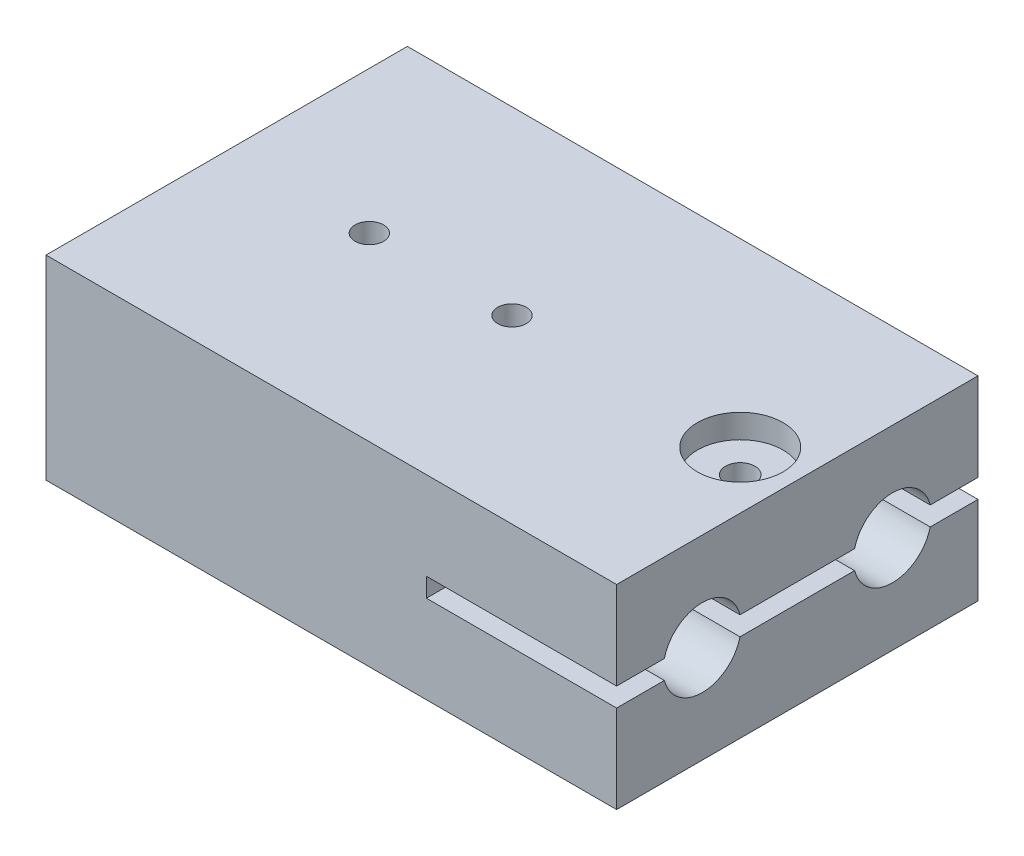
ISO-10303-21;
HEADER;
FILE_DESCRIPTION(('STEP AP214'),'2;1');
FILE_NAME('part.step','',(''),(''),'','','');
FILE_SCHEMA(('AUTOMOTIVE_DESIGN { 1 0 10303 214 1 1 1 1 }'));
ENDSEC;
DATA;
#1=APPLICATION_CONTEXT('core data for automotive mechanical design processes');
#2=APPLICATION_PROTOCOL_DEFINITION('international standard','automotive_design',2000,#1);
#3=PRODUCT_CONTEXT('',#1,'mechanical');
#4=PRODUCT('Part','Part','',(#3));
#5=PRODUCT_RELATED_PRODUCT_CATEGORY('part','',(#4));
#6=PRODUCT_DEFINITION_FORMATION('','',#4);
#7=PRODUCT_DEFINITION_CONTEXT('part definition',#1,'design');
#8=PRODUCT_DEFINITION('design','',#6,#7);
#9=PRODUCT_DEFINITION_SHAPE('','',#8);
#10=(LENGTH_UNIT() NAMED_UNIT(*) SI_UNIT(.MILLI.,.METRE.));
#11=(NAMED_UNIT(*) PLANE_ANGLE_UNIT() SI_UNIT($,.RADIAN.));
#12=(NAMED_UNIT(*) SI_UNIT($,.STERADIAN.) SOLID_ANGLE_UNIT());
#13=UNCERTAINTY_MEASURE_WITH_UNIT(LENGTH_MEASURE(1.E-05),#10,'distance_accuracy_value','');
#14=(GEOMETRIC_REPRESENTATION_CONTEXT(3) GLOBAL_UNCERTAINTY_ASSIGNED_CONTEXT((#13)) GLOBAL_UNIT_ASSIGNED_CONTEXT((#10,
#11,#12)) REPRESENTATION_CONTEXT('',''));
#15=CARTESIAN_POINT('',(0.,0.,0.));
#16=DIRECTION('',(0.,0.,1.));
#17=DIRECTION('',(1.,0.,0.));
#18=AXIS2_PLACEMENT_3D('',#15,#16,#17);
#19=CARTESIAN_POINT('',(54.,11.25,0.));
#20=DIRECTION('',(0.,-1.,0.));
#21=DIRECTION('',(0.,0.,-1.));
#22=AXIS2_PLACEMENT_3D('',#19,#20,#21);
#23=CYLINDRICAL_SURFACE('',#22,1.55);
#24=CARTESIAN_POINT('',(54.,0.999999999999997,0.));
#25=DIRECTION('',(0.,1.,0.));
#26=DIRECTION('',(0.,0.,1.));
#27=AXIS2_PLACEMENT_3D('',#24,#25,#26);
#28=CIRCLE('',#27,1.55);
#29=CARTESIAN_POINT('',(54.,0.999999999999997,1.55));
#30=VERTEX_POINT('',#29);
#31=EDGE_CURVE('E217',#30,#30,#28,.T.);
#32=ORIENTED_EDGE('',*,*,#31,.F.);
#33=EDGE_LOOP('',(#32));
#34=FACE_BOUND('',#33,.T.);
#35=CARTESIAN_POINT('',(54.,7.75,0.));
#36=DIRECTION('',(0.,1.,0.));
#37=DIRECTION('',(0.,0.,1.));
#38=AXIS2_PLACEMENT_3D('',#35,#36,#37);
#39=CIRCLE('',#38,1.55);
#40=CARTESIAN_POINT('',(54.,7.75,1.55));
#41=VERTEX_POINT('',#40);
#42=EDGE_CURVE('E218',#41,#41,#39,.F.);
#43=ORIENTED_EDGE('',*,*,#42,.F.);
#44=EDGE_LOOP('',(#43));
#45=FACE_BOUND('',#44,.T.);
#46=ADVANCED_FACE('F39',(#34,#45),#23,.F.);
#47=CARTESIAN_POINT('',(60.,0.,0.));
#48=DIRECTION('',(-1.,0.,0.));
#49=DIRECTION('',(0.,0.,1.));
#50=AXIS2_PLACEMENT_3D('',#47,#48,#49);
#51=PLANE('',#50);
#52=DIRECTION('',(0.,1.,0.));
#53=VECTOR('',#52,1.);
#54=CARTESIAN_POINT('',(60.,-10.75,-19.));
#55=LINE('',#54,#53);
#56=CARTESIAN_POINT('',(60.,0.999999999999998,-19.));
#57=VERTEX_POINT('',#56);
#58=CARTESIAN_POINT('',(60.,10.25,-19.));
#59=VERTEX_POINT('',#58);
#60=EDGE_CURVE('E168',#57,#59,#55,.T.);
#61=ORIENTED_EDGE('',*,*,#60,.T.);
#62=DIRECTION('',(0.,0.,1.));
#63=VECTOR('',#62,1.);
#64=CARTESIAN_POINT('',(60.,10.25,-19.));
#65=LINE('',#64,#63);
#66=CARTESIAN_POINT('',(60.,10.25,19.));
#67=VERTEX_POINT('',#66);
#68=EDGE_CURVE('E153',#59,#67,#65,.T.);
#69=ORIENTED_EDGE('',*,*,#68,.T.);
#70=DIRECTION('',(0.,-1.,0.));
#71=VECTOR('',#70,1.);
#72=CARTESIAN_POINT('',(60.,-10.75,19.));
#73=LINE('',#72,#71);
#74=CARTESIAN_POINT('',(60.,0.999999999999998,19.));
#75=VERTEX_POINT('',#74);
#76=EDGE_CURVE('E191',#67,#75,#73,.T.);
#77=ORIENTED_EDGE('',*,*,#76,.T.);
#78=DIRECTION('',(0.,0.,1.));
#79=VECTOR('',#78,1.);
#80=CARTESIAN_POINT('',(60.,0.999999999999998,-20.));
#81=LINE('',#80,#79);
#82=CARTESIAN_POINT('',(60.,0.999999999999998,13.9761790704142));
#83=VERTEX_POINT('',#82);
#84=EDGE_CURVE('E292',#83,#75,#81,.T.);
#85=ORIENTED_EDGE('',*,*,#84,.F.);
#86=CARTESIAN_POINT('',(60.,0.,10.));
#87=DIRECTION('',(1.,0.,0.));
#88=DIRECTION('',(0.,0.,-1.));
#89=AXIS2_PLACEMENT_3D('',#86,#87,#88);
#90=CIRCLE('',#89,4.1);
#91=CARTESIAN_POINT('',(60.,0.999999999999998,6.02382092958579));
#92=VERTEX_POINT('',#91);
#93=EDGE_CURVE('E343',#92,#83,#90,.T.);
#94=ORIENTED_EDGE('',*,*,#93,.F.);
#95=CARTESIAN_POINT('',(60.,0.999999999999998,-6.02382092958579));
#96=VERTEX_POINT('',#95);
#97=EDGE_CURVE('E296',#96,#92,#81,.T.);
#98=ORIENTED_EDGE('',*,*,#97,.F.);
#99=CARTESIAN_POINT('',(60.,0.,-10.));
#100=DIRECTION('',(1.,0.,0.));
#101=DIRECTION('',(0.,0.,-1.));
#102=AXIS2_PLACEMENT_3D('',#99,#100,#101);
#103=CIRCLE('',#102,4.1);
#104=CARTESIAN_POINT('',(60.,0.999999999999998,-13.9761790704142));
#105=VERTEX_POINT('',#104);
#106=EDGE_CURVE('E189',#105,#96,#103,.T.);
#107=ORIENTED_EDGE('',*,*,#106,.F.);
#108=EDGE_CURVE('E177',#57,#105,#81,.T.);
#109=ORIENTED_EDGE('',*,*,#108,.F.);
#110=EDGE_LOOP('',(#61,#69,#77,#85,#94,#98,#107,#109));
#111=FACE_BOUND('',#110,.T.);
#112=ADVANCED_FACE('F175',(#111),#51,.F.);
#113=CARTESIAN_POINT('',(60.,-10.75,-19.));
#114=DIRECTION('',(0.,0.,1.));
#115=DIRECTION('',(1.,0.,0.));
#116=AXIS2_PLACEMENT_3D('',#113,#114,#115);
#117=PLANE('',#116);
#118=DIRECTION('',(0.,1.,0.));
#119=VECTOR('',#118,1.);
#120=CARTESIAN_POINT('',(0.,-10.75,-19.));
#121=LINE('',#120,#119);
#122=CARTESIAN_POINT('',(0.,-10.25,-19.));
#123=VERTEX_POINT('',#122);
#124=CARTESIAN_POINT('',(0.,10.25,-19.));
#125=VERTEX_POINT('',#124);
#126=EDGE_CURVE('E171',#123,#125,#121,.T.);
#127=ORIENTED_EDGE('',*,*,#126,.T.);
#128=DIRECTION('',(-1.,0.,0.));
#129=VECTOR('',#128,1.);
#130=CARTESIAN_POINT('',(60.,10.25,-19.));
#131=LINE('',#130,#129);
#132=EDGE_CURVE('E65',#59,#125,#131,.T.);
#133=ORIENTED_EDGE('',*,*,#132,.F.);
#134=ORIENTED_EDGE('',*,*,#60,.F.);
#135=DIRECTION('',(-1.,0.,0.));
#136=VECTOR('',#135,1.);
#137=CARTESIAN_POINT('',(60.,0.999999999999997,-19.));
#138=LINE('',#137,#136);
#139=CARTESIAN_POINT('',(40.,0.999999999999998,-19.));
#140=VERTEX_POINT('',#139);
#141=EDGE_CURVE('E327',#57,#140,#138,.T.);
#142=ORIENTED_EDGE('',*,*,#141,.T.);
#143=DIRECTION('',(0.,-1.,0.));
#144=VECTOR('',#143,1.);
#145=CARTESIAN_POINT('',(40.,-10.75,-19.));
#146=LINE('',#145,#144);
#147=CARTESIAN_POINT('',(40.,-1.,-19.));
#148=VERTEX_POINT('',#147);
#149=EDGE_CURVE('E335',#140,#148,#146,.T.);
#150=ORIENTED_EDGE('',*,*,#149,.T.);
#151=DIRECTION('',(1.,0.,0.));
#152=VECTOR('',#151,1.);
#153=CARTESIAN_POINT('',(60.,-1.,-19.));
#154=LINE('',#153,#152);
#155=CARTESIAN_POINT('',(60.,-1.,-19.));
#156=VERTEX_POINT('',#155);
#157=EDGE_CURVE('E315',#148,#156,#154,.T.);
#158=ORIENTED_EDGE('',*,*,#157,.T.);
#159=CARTESIAN_POINT('',(60.,-10.25,-19.));
#160=VERTEX_POINT('',#159);
#161=EDGE_CURVE('E179',#160,#156,#55,.T.);
#162=ORIENTED_EDGE('',*,*,#161,.F.);
#163=DIRECTION('',(-1.,0.,0.));
#164=VECTOR('',#163,1.);
#165=CARTESIAN_POINT('',(60.,-10.25,-19.));
#166=LINE('',#165,#164);
#167=EDGE_CURVE('E245',#160,#123,#166,.T.);
#168=ORIENTED_EDGE('',*,*,#167,.T.);
#169=EDGE_LOOP('',(#127,#133,#134,#142,#150,#158,#162,#168));
#170=FACE_BOUND('',#169,.T.);
#171=ADVANCED_FACE('F41',(#170),#117,.F.);
#172=CARTESIAN_POINT('',(60.,-10.75,19.));
#173=DIRECTION('',(0.,0.,-1.));
#174=DIRECTION('',(-1.,0.,0.));
#175=AXIS2_PLACEMENT_3D('',#172,#173,#174);
#176=PLANE('',#175);
#177=ORIENTED_EDGE('',*,*,#76,.F.);
#178=DIRECTION('',(-1.,0.,0.));
#179=VECTOR('',#178,1.);
#180=CARTESIAN_POINT('',(60.,10.25,19.));
#181=LINE('',#180,#179);
#182=CARTESIAN_POINT('',(0.,10.25,19.));
#183=VERTEX_POINT('',#182);
#184=EDGE_CURVE('E157',#67,#183,#181,.T.);
#185=ORIENTED_EDGE('',*,*,#184,.T.);
#186=DIRECTION('',(0.,-1.,0.));
#187=VECTOR('',#186,1.);
#188=CARTESIAN_POINT('',(0.,-10.75,19.));
#189=LINE('',#188,#187);
#190=CARTESIAN_POINT('',(0.,-10.25,19.));
#191=VERTEX_POINT('',#190);
#192=EDGE_CURVE('E180',#183,#191,#189,.T.);
#193=ORIENTED_EDGE('',*,*,#192,.T.);
#194=DIRECTION('',(-1.,0.,0.));
#195=VECTOR('',#194,1.);
#196=CARTESIAN_POINT('',(60.,-10.25,19.));
#197=LINE('',#196,#195);
#198=CARTESIAN_POINT('',(60.,-10.25,19.));
#199=VERTEX_POINT('',#198);
#200=EDGE_CURVE('E57',#199,#191,#197,.T.);
#201=ORIENTED_EDGE('',*,*,#200,.F.);
#202=CARTESIAN_POINT('',(60.,-1.,19.));
#203=VERTEX_POINT('',#202);
#204=EDGE_CURVE('E184',#203,#199,#73,.T.);
#205=ORIENTED_EDGE('',*,*,#204,.F.);
#206=DIRECTION('',(1.,0.,0.));
#207=VECTOR('',#206,1.);
#208=CARTESIAN_POINT('',(40.,-1.,19.));
#209=LINE('',#208,#207);
#210=CARTESIAN_POINT('',(40.,-1.,19.));
#211=VERTEX_POINT('',#210);
#212=EDGE_CURVE('E279',#211,#203,#209,.T.);
#213=ORIENTED_EDGE('',*,*,#212,.F.);
#214=DIRECTION('',(0.,-1.,0.));
#215=VECTOR('',#214,1.);
#216=CARTESIAN_POINT('',(40.,0.999999999999998,19.));
#217=LINE('',#216,#215);
#218=CARTESIAN_POINT('',(40.,0.999999999999998,19.));
#219=VERTEX_POINT('',#218);
#220=EDGE_CURVE('E275',#219,#211,#217,.T.);
#221=ORIENTED_EDGE('',*,*,#220,.F.);
#222=DIRECTION('',(-1.,0.,0.));
#223=VECTOR('',#222,1.);
#224=CARTESIAN_POINT('',(40.,0.999999999999998,19.));
#225=LINE('',#224,#223);
#226=EDGE_CURVE('E282',#75,#219,#225,.T.);
#227=ORIENTED_EDGE('',*,*,#226,.F.);
#228=EDGE_LOOP('',(#177,#185,#193,#201,#205,#213,#221,#227));
#229=FACE_BOUND('',#228,.T.);
#230=ADVANCED_FACE('F447',(#229),#176,.F.);
#231=ORIENTED_EDGE('',*,*,#204,.T.);
#232=DIRECTION('',(0.,0.,-1.));
#233=VECTOR('',#232,1.);
#234=CARTESIAN_POINT('',(60.,-10.25,-19.));
#235=LINE('',#234,#233);
#236=EDGE_CURVE('E238',#199,#160,#235,.T.);
#237=ORIENTED_EDGE('',*,*,#236,.T.);
#238=ORIENTED_EDGE('',*,*,#161,.T.);
#239=DIRECTION('',(0.,0.,1.));
#240=VECTOR('',#239,1.);
#241=CARTESIAN_POINT('',(60.,-1.,-20.));
#242=LINE('',#241,#240);
#243=CARTESIAN_POINT('',(60.,-1.,-13.9761790704142));
#244=VERTEX_POINT('',#243);
#245=EDGE_CURVE('E297',#156,#244,#242,.T.);
#246=ORIENTED_EDGE('',*,*,#245,.T.);
#247=CARTESIAN_POINT('',(60.,-1.,-6.02382092958579));
#248=VERTEX_POINT('',#247);
#249=EDGE_CURVE('E339',#248,#244,#103,.T.);
#250=ORIENTED_EDGE('',*,*,#249,.F.);
#251=CARTESIAN_POINT('',(60.,-1.,6.02382092958579));
#252=VERTEX_POINT('',#251);
#253=EDGE_CURVE('E302',#248,#252,#242,.T.);
#254=ORIENTED_EDGE('',*,*,#253,.T.);
#255=CARTESIAN_POINT('',(60.,-1.,13.9761790704142));
#256=VERTEX_POINT('',#255);
#257=EDGE_CURVE('E346',#256,#252,#90,.T.);
#258=ORIENTED_EDGE('',*,*,#257,.F.);
#259=EDGE_CURVE('E298',#256,#203,#242,.T.);
#260=ORIENTED_EDGE('',*,*,#259,.T.);
#261=EDGE_LOOP('',(#231,#237,#238,#246,#250,#254,#258,#260));
#262=FACE_BOUND('',#261,.T.);
#263=ADVANCED_FACE('F366',(#262),#51,.F.);
#264=CARTESIAN_POINT('',(0.,0.,0.));
#265=DIRECTION('',(-1.,0.,0.));
#266=DIRECTION('',(0.,0.,1.));
#267=AXIS2_PLACEMENT_3D('',#264,#265,#266);
#268=PLANE('',#267);
#269=DIRECTION('',(0.,0.,1.));
#270=VECTOR('',#269,1.);
#271=CARTESIAN_POINT('',(0.,10.25,-19.));
#272=LINE('',#271,#270);
#273=EDGE_CURVE('E162',#125,#183,#272,.T.);
#274=ORIENTED_EDGE('',*,*,#273,.F.);
#275=ORIENTED_EDGE('',*,*,#126,.F.);
#276=DIRECTION('',(0.,0.,-1.));
#277=VECTOR('',#276,1.);
#278=CARTESIAN_POINT('',(0.,-10.25,-19.));
#279=LINE('',#278,#277);
#280=EDGE_CURVE('E242',#191,#123,#279,.T.);
#281=ORIENTED_EDGE('',*,*,#280,.F.);
#282=ORIENTED_EDGE('',*,*,#192,.F.);
#283=EDGE_LOOP('',(#274,#275,#281,#282));
#284=FACE_BOUND('',#283,.T.);
#285=CARTESIAN_POINT('',(0.,0.,10.));
#286=DIRECTION('',(1.,0.,0.));
#287=DIRECTION('',(0.,0.,-1.));
#288=AXIS2_PLACEMENT_3D('',#285,#286,#287);
#289=CIRCLE('',#288,4.1);
#290=CARTESIAN_POINT('',(0.,0.,5.9));
#291=VERTEX_POINT('',#290);
#292=EDGE_CURVE('E196',#291,#291,#289,.T.);
#293=ORIENTED_EDGE('',*,*,#292,.T.);
#294=EDGE_LOOP('',(#293));
#295=FACE_BOUND('',#294,.T.);
#296=CARTESIAN_POINT('',(0.,0.,-10.));
#297=DIRECTION('',(1.,0.,0.));
#298=DIRECTION('',(0.,0.,-1.));
#299=AXIS2_PLACEMENT_3D('',#296,#297,#298);
#300=CIRCLE('',#299,4.1);
#301=CARTESIAN_POINT('',(0.,0.,-14.1));
#302=VERTEX_POINT('',#301);
#303=EDGE_CURVE('E347',#302,#302,#300,.T.);
#304=ORIENTED_EDGE('',*,*,#303,.T.);
#305=EDGE_LOOP('',(#304));
#306=FACE_BOUND('',#305,.T.);
#307=ADVANCED_FACE('F451',(#284,#295,#306),#268,.T.);
#308=CARTESIAN_POINT('',(0.,0.,-10.));
#309=DIRECTION('',(1.,0.,0.));
#310=DIRECTION('',(0.,0.,-1.));
#311=AXIS2_PLACEMENT_3D('',#308,#309,#310);
#312=CYLINDRICAL_SURFACE('',#311,4.1);
#313=ORIENTED_EDGE('',*,*,#303,.F.);
#314=EDGE_LOOP('',(#313));
#315=FACE_BOUND('',#314,.T.);
#316=CARTESIAN_POINT('',(40.,0.,-10.));
#317=DIRECTION('',(-1.,0.,0.));
#318=DIRECTION('',(0.,0.,1.));
#319=AXIS2_PLACEMENT_3D('',#316,#317,#318);
#320=CIRCLE('',#319,4.1);
#321=CARTESIAN_POINT('',(40.,-1.,-13.9761790704142));
#322=VERTEX_POINT('',#321);
#323=CARTESIAN_POINT('',(40.,0.999999999999998,-13.9761790704142));
#324=VERTEX_POINT('',#323);
#325=EDGE_CURVE('E334',#322,#324,#320,.F.);
#326=ORIENTED_EDGE('',*,*,#325,.T.);
#327=DIRECTION('',(1.,0.,0.));
#328=VECTOR('',#327,1.);
#329=CARTESIAN_POINT('',(0.,0.999999999999998,-13.9761790704142));
#330=LINE('',#329,#328);
#331=EDGE_CURVE('E319',#324,#105,#330,.T.);
#332=ORIENTED_EDGE('',*,*,#331,.T.);
#333=ORIENTED_EDGE('',*,*,#106,.T.);
#334=DIRECTION('',(1.,0.,0.));
#335=VECTOR('',#334,1.);
#336=CARTESIAN_POINT('',(0.,0.999999999999998,-6.02382092958579));
#337=LINE('',#336,#335);
#338=CARTESIAN_POINT('',(40.,0.999999999999998,-6.02382092958579));
#339=VERTEX_POINT('',#338);
#340=EDGE_CURVE('E323',#96,#339,#337,.F.);
#341=ORIENTED_EDGE('',*,*,#340,.T.);
#342=CARTESIAN_POINT('',(40.,-1.,-6.02382092958579));
#343=VERTEX_POINT('',#342);
#344=EDGE_CURVE('E330',#339,#343,#320,.F.);
#345=ORIENTED_EDGE('',*,*,#344,.T.);
#346=DIRECTION('',(1.,0.,0.));
#347=VECTOR('',#346,1.);
#348=CARTESIAN_POINT('',(0.,-1.,-6.02382092958579));
#349=LINE('',#348,#347);
#350=EDGE_CURVE('E307',#343,#248,#349,.T.);
#351=ORIENTED_EDGE('',*,*,#350,.T.);
#352=ORIENTED_EDGE('',*,*,#249,.T.);
#353=DIRECTION('',(1.,0.,0.));
#354=VECTOR('',#353,1.);
#355=CARTESIAN_POINT('',(0.,-1.,-13.9761790704142));
#356=LINE('',#355,#354);
#357=EDGE_CURVE('E311',#244,#322,#356,.F.);
#358=ORIENTED_EDGE('',*,*,#357,.T.);
#359=EDGE_LOOP('',(#326,#332,#333,#341,#345,#351,#352,#358));
#360=FACE_BOUND('',#359,.T.);
#361=ADVANCED_FACE('F361',(#315,#360),#312,.F.);
#362=CARTESIAN_POINT('',(0.,0.,10.));
#363=DIRECTION('',(1.,0.,0.));
#364=DIRECTION('',(0.,0.,-1.));
#365=AXIS2_PLACEMENT_3D('',#362,#363,#364);
#366=CYLINDRICAL_SURFACE('',#365,4.1);
#367=ORIENTED_EDGE('',*,*,#292,.F.);
#368=EDGE_LOOP('',(#367));
#369=FACE_BOUND('',#368,.T.);
#370=CARTESIAN_POINT('',(40.,0.,10.));
#371=DIRECTION('',(-1.,0.,0.));
#372=DIRECTION('',(0.,0.,1.));
#373=AXIS2_PLACEMENT_3D('',#370,#371,#372);
#374=CIRCLE('',#373,4.1);
#375=CARTESIAN_POINT('',(40.,-1.,6.02382092958579));
#376=VERTEX_POINT('',#375);
#377=CARTESIAN_POINT('',(40.,0.999999999999998,6.02382092958579));
#378=VERTEX_POINT('',#377);
#379=EDGE_CURVE('E49',#376,#378,#374,.F.);
#380=ORIENTED_EDGE('',*,*,#379,.T.);
#381=DIRECTION('',(1.,0.,0.));
#382=VECTOR('',#381,1.);
#383=CARTESIAN_POINT('',(0.,0.999999999999998,6.02382092958579));
#384=LINE('',#383,#382);
#385=EDGE_CURVE('E11',#378,#92,#384,.T.);
#386=ORIENTED_EDGE('',*,*,#385,.T.);
#387=ORIENTED_EDGE('',*,*,#93,.T.);
#388=DIRECTION('',(1.,0.,0.));
#389=VECTOR('',#388,1.);
#390=CARTESIAN_POINT('',(0.,0.999999999999998,13.9761790704142));
#391=LINE('',#390,#389);
#392=CARTESIAN_POINT('',(40.,0.999999999999998,13.9761790704142));
#393=VERTEX_POINT('',#392);
#394=EDGE_CURVE('E205',#83,#393,#391,.F.);
#395=ORIENTED_EDGE('',*,*,#394,.T.);
#396=CARTESIAN_POINT('',(40.,-1.,13.9761790704142));
#397=VERTEX_POINT('',#396);
#398=EDGE_CURVE('E201',#393,#397,#374,.F.);
#399=ORIENTED_EDGE('',*,*,#398,.T.);
#400=DIRECTION('',(1.,0.,0.));
#401=VECTOR('',#400,1.);
#402=CARTESIAN_POINT('',(0.,-1.,13.9761790704142));
#403=LINE('',#402,#401);
#404=EDGE_CURVE('E194',#397,#256,#403,.T.);
#405=ORIENTED_EDGE('',*,*,#404,.T.);
#406=ORIENTED_EDGE('',*,*,#257,.T.);
#407=DIRECTION('',(1.,0.,0.));
#408=VECTOR('',#407,1.);
#409=CARTESIAN_POINT('',(0.,-1.,6.02382092958579));
#410=LINE('',#409,#408);
#411=EDGE_CURVE('E209',#252,#376,#410,.F.);
#412=ORIENTED_EDGE('',*,*,#411,.T.);
#413=EDGE_LOOP('',(#380,#386,#387,#395,#399,#405,#406,#412));
#414=FACE_BOUND('',#413,.T.);
#415=ADVANCED_FACE('F443',(#369,#414),#366,.F.);
#416=CARTESIAN_POINT('',(40.,-1.,-20.));
#417=DIRECTION('',(0.,-1.,0.));
#418=DIRECTION('',(1.,0.,0.));
#419=AXIS2_PLACEMENT_3D('',#416,#417,#418);
#420=PLANE('',#419);
#421=DIRECTION('',(0.,0.,1.));
#422=VECTOR('',#421,1.);
#423=CARTESIAN_POINT('',(40.,-1.,-20.));
#424=LINE('',#423,#422);
#425=EDGE_CURVE('E286',#397,#211,#424,.T.);
#426=ORIENTED_EDGE('',*,*,#425,.T.);
#427=ORIENTED_EDGE('',*,*,#212,.T.);
#428=ORIENTED_EDGE('',*,*,#259,.F.);
#429=ORIENTED_EDGE('',*,*,#404,.F.);
#430=EDGE_LOOP('',(#426,#427,#428,#429));
#431=FACE_BOUND('',#430,.T.);
#432=ADVANCED_FACE('F432',(#431),#420,.F.);
#433=CARTESIAN_POINT('',(40.,0.999999999999998,-20.));
#434=DIRECTION('',(0.,1.,0.));
#435=DIRECTION('',(0.,0.,1.));
#436=AXIS2_PLACEMENT_3D('',#433,#434,#435);
#437=PLANE('',#436);
#438=ORIENTED_EDGE('',*,*,#84,.T.);
#439=ORIENTED_EDGE('',*,*,#226,.T.);
#440=DIRECTION('',(0.,0.,1.));
#441=VECTOR('',#440,1.);
#442=CARTESIAN_POINT('',(40.,0.999999999999998,-20.));
#443=LINE('',#442,#441);
#444=EDGE_CURVE('E287',#393,#219,#443,.T.);
#445=ORIENTED_EDGE('',*,*,#444,.F.);
#446=ORIENTED_EDGE('',*,*,#394,.F.);
#447=EDGE_LOOP('',(#438,#439,#445,#446));
#448=FACE_BOUND('',#447,.T.);
#449=ADVANCED_FACE('F470',(#448),#437,.F.);
#450=CARTESIAN_POINT('',(40.,0.999999999999998,-20.));
#451=DIRECTION('',(-1.,0.,0.));
#452=DIRECTION('',(0.,0.,1.));
#453=AXIS2_PLACEMENT_3D('',#450,#451,#452);
#454=PLANE('',#453);
#455=ORIENTED_EDGE('',*,*,#444,.T.);
#456=ORIENTED_EDGE('',*,*,#220,.T.);
#457=ORIENTED_EDGE('',*,*,#425,.F.);
#458=ORIENTED_EDGE('',*,*,#398,.F.);
#459=EDGE_LOOP('',(#455,#456,#457,#458));
#460=FACE_BOUND('',#459,.T.);
#461=ADVANCED_FACE('F430',(#460),#454,.F.);
#462=CARTESIAN_POINT('',(54.,-1.,0.));
#463=DIRECTION('',(0.,-1.,0.));
#464=DIRECTION('',(1.,0.,0.));
#465=AXIS2_PLACEMENT_3D('',#462,#463,#464);
#466=CIRCLE('',#465,1.55);
#467=CARTESIAN_POINT('',(55.55,-1.,0.));
#468=VERTEX_POINT('',#467);
#469=EDGE_CURVE('E267',#468,#468,#466,.T.);
#470=ORIENTED_EDGE('',*,*,#469,.T.);
#471=EDGE_LOOP('',(#470));
#472=FACE_BOUND('',#471,.T.);
#473=EDGE_CURVE('E306',#343,#376,#424,.T.);
#474=ORIENTED_EDGE('',*,*,#473,.T.);
#475=ORIENTED_EDGE('',*,*,#411,.F.);
#476=ORIENTED_EDGE('',*,*,#253,.F.);
#477=ORIENTED_EDGE('',*,*,#350,.F.);
#478=EDGE_LOOP('',(#474,#475,#476,#477));
#479=FACE_BOUND('',#478,.T.);
#480=ADVANCED_FACE('F426',(#472,#479),#420,.F.);
#481=ORIENTED_EDGE('',*,*,#31,.T.);
#482=EDGE_LOOP('',(#481));
#483=FACE_BOUND('',#482,.T.);
#484=ORIENTED_EDGE('',*,*,#97,.T.);
#485=ORIENTED_EDGE('',*,*,#385,.F.);
#486=EDGE_CURVE('E290',#339,#378,#443,.T.);
#487=ORIENTED_EDGE('',*,*,#486,.F.);
#488=ORIENTED_EDGE('',*,*,#340,.F.);
#489=EDGE_LOOP('',(#484,#485,#487,#488));
#490=FACE_BOUND('',#489,.T.);
#491=ADVANCED_FACE('F429',(#483,#490),#437,.F.);
#492=ORIENTED_EDGE('',*,*,#486,.T.);
#493=ORIENTED_EDGE('',*,*,#379,.F.);
#494=ORIENTED_EDGE('',*,*,#473,.F.);
#495=ORIENTED_EDGE('',*,*,#344,.F.);
#496=EDGE_LOOP('',(#492,#493,#494,#495));
#497=FACE_BOUND('',#496,.T.);
#498=ADVANCED_FACE('F439',(#497),#454,.F.);
#499=EDGE_CURVE('E291',#140,#324,#443,.T.);
#500=ORIENTED_EDGE('',*,*,#499,.T.);
#501=ORIENTED_EDGE('',*,*,#325,.F.);
#502=EDGE_CURVE('E303',#148,#322,#424,.T.);
#503=ORIENTED_EDGE('',*,*,#502,.F.);
#504=ORIENTED_EDGE('',*,*,#149,.F.);
#505=EDGE_LOOP('',(#500,#501,#503,#504));
#506=FACE_BOUND('',#505,.T.);
#507=ADVANCED_FACE('F457',(#506),#454,.F.);
#508=ORIENTED_EDGE('',*,*,#108,.T.);
#509=ORIENTED_EDGE('',*,*,#331,.F.);
#510=ORIENTED_EDGE('',*,*,#499,.F.);
#511=ORIENTED_EDGE('',*,*,#141,.F.);
#512=EDGE_LOOP('',(#508,#509,#510,#511));
#513=FACE_BOUND('',#512,.T.);
#514=ADVANCED_FACE('F480',(#513),#437,.F.);
#515=ORIENTED_EDGE('',*,*,#502,.T.);
#516=ORIENTED_EDGE('',*,*,#357,.F.);
#517=ORIENTED_EDGE('',*,*,#245,.F.);
#518=ORIENTED_EDGE('',*,*,#157,.F.);
#519=EDGE_LOOP('',(#515,#516,#517,#518));
#520=FACE_BOUND('',#519,.T.);
#521=ADVANCED_FACE('F433',(#520),#420,.F.);
#522=CARTESIAN_POINT('',(54.,-7.75,0.));
#523=DIRECTION('',(0.,-1.,0.));
#524=DIRECTION('',(0.,0.,-1.));
#525=AXIS2_PLACEMENT_3D('',#522,#523,#524);
#526=CYLINDRICAL_SURFACE('',#525,3.5);
#527=CARTESIAN_POINT('',(54.,-10.25,0.));
#528=DIRECTION('',(0.,1.,0.));
#529=DIRECTION('',(0.,0.,1.));
#530=AXIS2_PLACEMENT_3D('',#527,#528,#529);
#531=CIRCLE('',#530,3.5);
#532=CARTESIAN_POINT('',(54.,-10.25,3.5));
#533=VERTEX_POINT('',#532);
#534=EDGE_CURVE('E43',#533,#533,#531,.F.);
#535=ORIENTED_EDGE('',*,*,#534,.T.);
#536=EDGE_LOOP('',(#535));
#537=FACE_BOUND('',#536,.T.);
#538=CARTESIAN_POINT('',(54.,-7.75,0.));
#539=DIRECTION('',(0.,-1.,0.));
#540=DIRECTION('',(0.,0.,-1.));
#541=AXIS2_PLACEMENT_3D('',#538,#539,#540);
#542=CIRCLE('',#541,3.5);
#543=CARTESIAN_POINT('',(54.,-7.75,-3.5));
#544=VERTEX_POINT('',#543);
#545=EDGE_CURVE('E271',#544,#544,#542,.T.);
#546=ORIENTED_EDGE('',*,*,#545,.F.);
#547=EDGE_LOOP('',(#546));
#548=FACE_BOUND('',#547,.T.);
#549=ADVANCED_FACE('F379',(#537,#548),#526,.F.);
#550=CARTESIAN_POINT('',(54.,-7.75,0.));
#551=DIRECTION('',(0.,-1.,0.));
#552=DIRECTION('',(0.,0.,-1.));
#553=AXIS2_PLACEMENT_3D('',#550,#551,#552);
#554=PLANE('',#553);
#555=CARTESIAN_POINT('',(54.,-7.75,0.));
#556=DIRECTION('',(0.,-1.,0.));
#557=DIRECTION('',(0.,0.,-1.));
#558=AXIS2_PLACEMENT_3D('',#555,#556,#557);
#559=CIRCLE('',#558,1.55);
#560=CARTESIAN_POINT('',(54.,-7.75,-1.55));
#561=VERTEX_POINT('',#560);
#562=EDGE_CURVE('E213',#561,#561,#559,.T.);
#563=ORIENTED_EDGE('',*,*,#562,.F.);
#564=EDGE_LOOP('',(#563));
#565=FACE_BOUND('',#564,.T.);
#566=ORIENTED_EDGE('',*,*,#545,.T.);
#567=EDGE_LOOP('',(#566));
#568=FACE_BOUND('',#567,.T.);
#569=ADVANCED_FACE('F412',(#565,#568),#554,.T.);
#570=ORIENTED_EDGE('',*,*,#562,.T.);
#571=EDGE_LOOP('',(#570));
#572=FACE_BOUND('',#571,.T.);
#573=ORIENTED_EDGE('',*,*,#469,.F.);
#574=EDGE_LOOP('',(#573));
#575=FACE_BOUND('',#574,.T.);
#576=ADVANCED_FACE('F401',(#572,#575),#23,.F.);
#577=CARTESIAN_POINT('',(54.,7.75,0.));
#578=DIRECTION('',(0.,1.,0.));
#579=DIRECTION('',(0.,0.,1.));
#580=AXIS2_PLACEMENT_3D('',#577,#578,#579);
#581=PLANE('',#580);
#582=CARTESIAN_POINT('',(54.,7.75,0.));
#583=DIRECTION('',(0.,1.,0.));
#584=DIRECTION('',(0.,0.,1.));
#585=AXIS2_PLACEMENT_3D('',#582,#583,#584);
#586=CIRCLE('',#585,4.5);
#587=CARTESIAN_POINT('',(54.,7.75,4.5));
#588=VERTEX_POINT('',#587);
#589=EDGE_CURVE('E221',#588,#588,#586,.T.);
#590=ORIENTED_EDGE('',*,*,#589,.T.);
#591=EDGE_LOOP('',(#590));
#592=FACE_BOUND('',#591,.T.);
#593=ORIENTED_EDGE('',*,*,#42,.T.);
#594=EDGE_LOOP('',(#593));
#595=FACE_BOUND('',#594,.T.);
#596=ADVANCED_FACE('F411',(#592,#595),#581,.T.);
#597=CARTESIAN_POINT('',(54.,7.75,0.));
#598=DIRECTION('',(0.,1.,0.));
#599=DIRECTION('',(0.,0.,1.));
#600=AXIS2_PLACEMENT_3D('',#597,#598,#599);
#601=CYLINDRICAL_SURFACE('',#600,4.5);
#602=CARTESIAN_POINT('',(54.,10.25,0.));
#603=DIRECTION('',(0.,-1.,0.));
#604=DIRECTION('',(0.,0.,-1.));
#605=AXIS2_PLACEMENT_3D('',#602,#603,#604);
#606=CIRCLE('',#605,4.5);
#607=CARTESIAN_POINT('',(54.,10.25,-4.5));
#608=VERTEX_POINT('',#607);
#609=EDGE_CURVE('E231',#608,#608,#606,.F.);
#610=ORIENTED_EDGE('',*,*,#609,.T.);
#611=EDGE_LOOP('',(#610));
#612=FACE_BOUND('',#611,.T.);
#613=ORIENTED_EDGE('',*,*,#589,.F.);
#614=EDGE_LOOP('',(#613));
#615=FACE_BOUND('',#614,.T.);
#616=ADVANCED_FACE('F418',(#612,#615),#601,.F.);
#617=CARTESIAN_POINT('',(60.,10.25,-19.));
#618=DIRECTION('',(0.,-1.,0.));
#619=DIRECTION('',(0.,0.,-1.));
#620=AXIS2_PLACEMENT_3D('',#617,#618,#619);
#621=PLANE('',#620);
#622=CARTESIAN_POINT('',(30.,10.25,0.));
#623=DIRECTION('',(0.,-1.,0.));
#624=DIRECTION('',(0.,0.,-1.));
#625=AXIS2_PLACEMENT_3D('',#622,#623,#624);
#626=CIRCLE('',#625,1.5);
#627=CARTESIAN_POINT('',(30.,10.25,-1.50000000000001));
#628=VERTEX_POINT('',#627);
#629=EDGE_CURVE('E225',#628,#628,#626,.F.);
#630=ORIENTED_EDGE('',*,*,#629,.F.);
#631=EDGE_LOOP('',(#630));
#632=FACE_BOUND('',#631,.T.);
#633=ORIENTED_EDGE('',*,*,#273,.T.);
#634=ORIENTED_EDGE('',*,*,#184,.F.);
#635=ORIENTED_EDGE('',*,*,#68,.F.);
#636=ORIENTED_EDGE('',*,*,#132,.T.);
#637=EDGE_LOOP('',(#633,#634,#635,#636));
#638=FACE_BOUND('',#637,.T.);
#639=CARTESIAN_POINT('',(15.,10.25,0.));
#640=DIRECTION('',(0.,-1.,0.));
#641=DIRECTION('',(0.,0.,-1.));
#642=AXIS2_PLACEMENT_3D('',#639,#640,#641);
#643=CIRCLE('',#642,1.5);
#644=CARTESIAN_POINT('',(15.,10.25,-1.5));
#645=VERTEX_POINT('',#644);
#646=EDGE_CURVE('E222',#645,#645,#643,.F.);
#647=ORIENTED_EDGE('',*,*,#646,.F.);
#648=EDGE_LOOP('',(#647));
#649=FACE_BOUND('',#648,.T.);
#650=ORIENTED_EDGE('',*,*,#609,.F.);
#651=EDGE_LOOP('',(#650));
#652=FACE_BOUND('',#651,.T.);
#653=ADVANCED_FACE('F154',(#632,#638,#649,#652),#621,.F.);
#654=CARTESIAN_POINT('',(30.,-4.25,0.));
#655=DIRECTION('',(0.,1.,0.));
#656=DIRECTION('',(0.,0.,1.));
#657=AXIS2_PLACEMENT_3D('',#654,#655,#656);
#658=PLANE('',#657);
#659=CARTESIAN_POINT('',(30.,-4.25,0.));
#660=DIRECTION('',(0.,1.,0.));
#661=DIRECTION('',(0.,0.,1.));
#662=AXIS2_PLACEMENT_3D('',#659,#660,#661);
#663=CIRCLE('',#662,1.5);
#664=CARTESIAN_POINT('',(30.,-4.25,1.5));
#665=VERTEX_POINT('',#664);
#666=EDGE_CURVE('E257',#665,#665,#663,.T.);
#667=ORIENTED_EDGE('',*,*,#666,.T.);
#668=EDGE_LOOP('',(#667));
#669=FACE_BOUND('',#668,.T.);
#670=ADVANCED_FACE('F394',(#669),#658,.T.);
#671=CARTESIAN_POINT('',(30.,-4.25,0.));
#672=DIRECTION('',(0.,1.,0.));
#673=DIRECTION('',(0.,0.,1.));
#674=AXIS2_PLACEMENT_3D('',#671,#672,#673);
#675=CYLINDRICAL_SURFACE('',#674,1.5);
#676=ORIENTED_EDGE('',*,*,#629,.T.);
#677=EDGE_LOOP('',(#676));
#678=FACE_BOUND('',#677,.T.);
#679=ORIENTED_EDGE('',*,*,#666,.F.);
#680=EDGE_LOOP('',(#679));
#681=FACE_BOUND('',#680,.T.);
#682=ADVANCED_FACE('F385',(#678,#681),#675,.F.);
#683=CARTESIAN_POINT('',(60.,-10.25,-19.));
#684=DIRECTION('',(0.,1.,0.));
#685=DIRECTION('',(0.,0.,1.));
#686=AXIS2_PLACEMENT_3D('',#683,#684,#685);
#687=PLANE('',#686);
#688=ORIENTED_EDGE('',*,*,#280,.T.);
#689=ORIENTED_EDGE('',*,*,#167,.F.);
#690=ORIENTED_EDGE('',*,*,#236,.F.);
#691=ORIENTED_EDGE('',*,*,#200,.T.);
#692=EDGE_LOOP('',(#688,#689,#690,#691));
#693=FACE_BOUND('',#692,.T.);
#694=ORIENTED_EDGE('',*,*,#534,.F.);
#695=EDGE_LOOP('',(#694));
#696=FACE_BOUND('',#695,.T.);
#697=ADVANCED_FACE('F382',(#693,#696),#687,.F.);
#698=CARTESIAN_POINT('',(15.,-4.25,0.));
#699=DIRECTION('',(0.,1.,0.));
#700=DIRECTION('',(0.,0.,1.));
#701=AXIS2_PLACEMENT_3D('',#698,#699,#700);
#702=PLANE('',#701);
#703=CARTESIAN_POINT('',(15.,-4.25,0.));
#704=DIRECTION('',(0.,1.,0.));
#705=DIRECTION('',(0.,0.,1.));
#706=AXIS2_PLACEMENT_3D('',#703,#704,#705);
#707=CIRCLE('',#706,1.5);
#708=CARTESIAN_POINT('',(15.,-4.25,1.5));
#709=VERTEX_POINT('',#708);
#710=EDGE_CURVE('E253',#709,#709,#707,.T.);
#711=ORIENTED_EDGE('',*,*,#710,.T.);
#712=EDGE_LOOP('',(#711));
#713=FACE_BOUND('',#712,.T.);
#714=ADVANCED_FACE('F384',(#713),#702,.T.);
#715=CARTESIAN_POINT('',(15.,-4.25,0.));
#716=DIRECTION('',(0.,1.,0.));
#717=DIRECTION('',(0.,0.,1.));
#718=AXIS2_PLACEMENT_3D('',#715,#716,#717);
#719=CYLINDRICAL_SURFACE('',#718,1.5);
#720=ORIENTED_EDGE('',*,*,#646,.T.);
#721=EDGE_LOOP('',(#720));
#722=FACE_BOUND('',#721,.T.);
#723=ORIENTED_EDGE('',*,*,#710,.F.);
#724=EDGE_LOOP('',(#723));
#725=FACE_BOUND('',#724,.T.);
#726=ADVANCED_FACE('F391',(#722,#725),#719,.F.);
#727=CLOSED_SHELL('',(#46,#112,#171,#230,#263,#307,#361,#415,#432,#449,#461,#480,#491,#498,#507,
#514,#521,#549,#569,#576,#596,#616,#653,#670,#682,#697,#714,#726));
#728=MANIFOLD_SOLID_BREP('B2',#727);
#729=ADVANCED_BREP_SHAPE_REPRESENTATION('',(#18,#728),#14);
#730=SHAPE_DEFINITION_REPRESENTATION(#9,#729);
ENDSEC;
END-ISO-10303-21;
